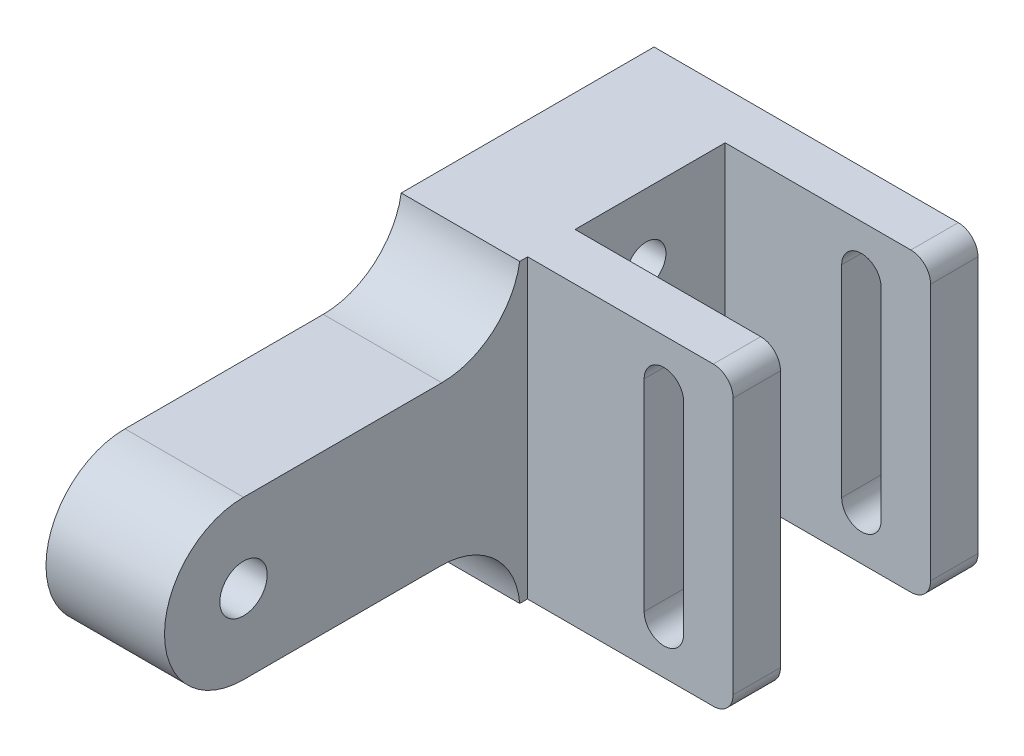
ISO-10303-21;
HEADER;
FILE_DESCRIPTION(('STEP AP214'),'2;1');
FILE_NAME('part.step','',(''),(''),'','','');
FILE_SCHEMA(('AUTOMOTIVE_DESIGN { 1 0 10303 214 1 1 1 1 }'));
ENDSEC;
DATA;
#1=APPLICATION_CONTEXT('core data for automotive mechanical design processes');
#2=APPLICATION_PROTOCOL_DEFINITION('international standard','automotive_design',2000,#1);
#3=PRODUCT_CONTEXT('',#1,'mechanical');
#4=PRODUCT('Part','Part','',(#3));
#5=PRODUCT_RELATED_PRODUCT_CATEGORY('part','',(#4));
#6=PRODUCT_DEFINITION_FORMATION('','',#4);
#7=PRODUCT_DEFINITION_CONTEXT('part definition',#1,'design');
#8=PRODUCT_DEFINITION('design','',#6,#7);
#9=PRODUCT_DEFINITION_SHAPE('','',#8);
#10=(LENGTH_UNIT() NAMED_UNIT(*) SI_UNIT(.MILLI.,.METRE.));
#11=(NAMED_UNIT(*) PLANE_ANGLE_UNIT() SI_UNIT($,.RADIAN.));
#12=(NAMED_UNIT(*) SI_UNIT($,.STERADIAN.) SOLID_ANGLE_UNIT());
#13=UNCERTAINTY_MEASURE_WITH_UNIT(LENGTH_MEASURE(1.E-05),#10,'distance_accuracy_value','');
#14=(GEOMETRIC_REPRESENTATION_CONTEXT(3) GLOBAL_UNCERTAINTY_ASSIGNED_CONTEXT((#13)) GLOBAL_UNIT_ASSIGNED_CONTEXT((#10,
#11,#12)) REPRESENTATION_CONTEXT('',''));
#15=CARTESIAN_POINT('',(0.,0.,0.));
#16=DIRECTION('',(0.,0.,1.));
#17=DIRECTION('',(1.,0.,0.));
#18=AXIS2_PLACEMENT_3D('',#15,#16,#17);
#19=CARTESIAN_POINT('',(30.,-39.244278892318,51.9237920874972));
#20=DIRECTION('',(-1.,0.,0.));
#21=DIRECTION('',(0.,0.,1.));
#22=AXIS2_PLACEMENT_3D('',#19,#20,#21);
#23=PLANE('',#22);
#24=CARTESIAN_POINT('',(30.,-16.6963557226771,0.));
#25=DIRECTION('',(1.,0.,0.));
#26=DIRECTION('',(0.,0.,-1.));
#27=AXIS2_PLACEMENT_3D('',#24,#25,#26);
#28=CIRCLE('',#27,5.);
#29=CARTESIAN_POINT('',(30.,-16.6963557226771,-5.));
#30=VERTEX_POINT('',#29);
#31=EDGE_CURVE('E390',#30,#30,#28,.T.);
#32=ORIENTED_EDGE('',*,*,#31,.F.);
#33=EDGE_LOOP('',(#32));
#34=FACE_BOUND('',#33,.T.);
#35=CARTESIAN_POINT('',(30.,20.755721107682,0.));
#36=DIRECTION('',(1.,0.,0.));
#37=DIRECTION('',(0.,0.,-1.));
#38=AXIS2_PLACEMENT_3D('',#35,#36,#37);
#39=CIRCLE('',#38,5.);
#40=CARTESIAN_POINT('',(30.,20.755721107682,-5.));
#41=VERTEX_POINT('',#40);
#42=EDGE_CURVE('E396',#41,#41,#39,.T.);
#43=ORIENTED_EDGE('',*,*,#42,.F.);
#44=EDGE_LOOP('',(#43));
#45=FACE_BOUND('',#44,.T.);
#46=DIRECTION('',(0.,1.,0.));
#47=VECTOR('',#46,1.);
#48=CARTESIAN_POINT('',(30.,37.5,18.));
#49=LINE('',#48,#47);
#50=CARTESIAN_POINT('',(30.,-37.5,18.));
#51=VERTEX_POINT('',#50);
#52=CARTESIAN_POINT('',(30.,37.5,18.));
#53=VERTEX_POINT('',#52);
#54=EDGE_CURVE('E265',#51,#53,#49,.T.);
#55=ORIENTED_EDGE('',*,*,#54,.F.);
#56=DIRECTION('',(0.,0.,-1.));
#57=VECTOR('',#56,1.);
#58=CARTESIAN_POINT('',(30.,-37.5,32.));
#59=LINE('',#58,#57);
#60=CARTESIAN_POINT('',(30.,-37.5,-20.));
#61=VERTEX_POINT('',#60);
#62=EDGE_CURVE('E425',#51,#61,#59,.T.);
#63=ORIENTED_EDGE('',*,*,#62,.T.);
#64=DIRECTION('',(0.,1.,0.));
#65=VECTOR('',#64,1.);
#66=CARTESIAN_POINT('',(30.,37.5,-20.));
#67=LINE('',#66,#65);
#68=CARTESIAN_POINT('',(30.,37.5,-20.));
#69=VERTEX_POINT('',#68);
#70=EDGE_CURVE('E11',#61,#69,#67,.T.);
#71=ORIENTED_EDGE('',*,*,#70,.T.);
#72=DIRECTION('',(0.,0.,1.));
#73=VECTOR('',#72,1.);
#74=CARTESIAN_POINT('',(30.,37.5,32.));
#75=LINE('',#74,#73);
#76=EDGE_CURVE('E57',#69,#53,#75,.T.);
#77=ORIENTED_EDGE('',*,*,#76,.T.);
#78=EDGE_LOOP('',(#55,#63,#71,#77));
#79=FACE_BOUND('',#78,.T.);
#80=ADVANCED_FACE('F33',(#34,#45,#79),#23,.F.);
#81=CARTESIAN_POINT('',(30.,-37.5,32.));
#82=VERTEX_POINT('',#81);
#83=CARTESIAN_POINT('',(30.,-37.5,30.));
#84=VERTEX_POINT('',#83);
#85=EDGE_CURVE('E421',#82,#84,#59,.T.);
#86=ORIENTED_EDGE('',*,*,#85,.T.);
#87=DIRECTION('',(0.,1.,0.));
#88=VECTOR('',#87,1.);
#89=CARTESIAN_POINT('',(30.,37.5,30.));
#90=LINE('',#89,#88);
#91=CARTESIAN_POINT('',(30.,37.5,30.));
#92=VERTEX_POINT('',#91);
#93=EDGE_CURVE('E50',#84,#92,#90,.T.);
#94=ORIENTED_EDGE('',*,*,#93,.T.);
#95=CARTESIAN_POINT('',(30.,37.5,32.));
#96=VERTEX_POINT('',#95);
#97=EDGE_CURVE('E410',#92,#96,#75,.T.);
#98=ORIENTED_EDGE('',*,*,#97,.T.);
#99=CARTESIAN_POINT('',(30.,40.755721107682,51.7332278167814));
#100=DIRECTION('',(-1.,0.,0.));
#101=DIRECTION('',(0.,0.,-1.));
#102=AXIS2_PLACEMENT_3D('',#99,#100,#101);
#103=CIRCLE('',#102,20.);
#104=CARTESIAN_POINT('',(30.,20.755721107682,51.7332278167814));
#105=VERTEX_POINT('',#104);
#106=EDGE_CURVE('E409',#96,#105,#103,.T.);
#107=ORIENTED_EDGE('',*,*,#106,.T.);
#108=DIRECTION('',(0.,0.,1.));
#109=VECTOR('',#108,1.);
#110=CARTESIAN_POINT('',(30.,20.755721107682,101.923792087497));
#111=LINE('',#110,#109);
#112=CARTESIAN_POINT('',(30.,20.755721107682,101.923792087497));
#113=VERTEX_POINT('',#112);
#114=EDGE_CURVE('E412',#105,#113,#111,.T.);
#115=ORIENTED_EDGE('',*,*,#114,.T.);
#116=CARTESIAN_POINT('',(30.,0.755721107682024,101.923792087497));
#117=DIRECTION('',(1.,0.,0.));
#118=DIRECTION('',(0.,0.,-1.));
#119=AXIS2_PLACEMENT_3D('',#116,#117,#118);
#120=CIRCLE('',#119,20.);
#121=CARTESIAN_POINT('',(30.,-19.244278892318,101.923792087497));
#122=VERTEX_POINT('',#121);
#123=EDGE_CURVE('E414',#113,#122,#120,.T.);
#124=ORIENTED_EDGE('',*,*,#123,.T.);
#125=DIRECTION('',(0.,0.,-1.));
#126=VECTOR('',#125,1.);
#127=CARTESIAN_POINT('',(30.,-19.244278892318,101.923792087497));
#128=LINE('',#127,#126);
#129=CARTESIAN_POINT('',(30.,-19.244278892318,51.9237920874972));
#130=VERTEX_POINT('',#129);
#131=EDGE_CURVE('E416',#122,#130,#128,.T.);
#132=ORIENTED_EDGE('',*,*,#131,.T.);
#133=CARTESIAN_POINT('',(30.,-39.244278892318,51.9237920874972));
#134=DIRECTION('',(-1.,0.,0.));
#135=DIRECTION('',(0.,0.,1.));
#136=AXIS2_PLACEMENT_3D('',#133,#134,#135);
#137=CIRCLE('',#136,20.);
#138=EDGE_CURVE('E418',#130,#82,#137,.T.);
#139=ORIENTED_EDGE('',*,*,#138,.T.);
#140=EDGE_LOOP('',(#86,#94,#98,#107,#115,#124,#132,#139));
#141=FACE_BOUND('',#140,.T.);
#142=CARTESIAN_POINT('',(30.,0.755721107682024,101.923792087497));
#143=DIRECTION('',(1.,0.,0.));
#144=DIRECTION('',(0.,0.,-1.));
#145=AXIS2_PLACEMENT_3D('',#142,#143,#144);
#146=CIRCLE('',#145,6.);
#147=CARTESIAN_POINT('',(30.,0.755721107682024,95.9237920874971));
#148=VERTEX_POINT('',#147);
#149=EDGE_CURVE('E402',#148,#148,#146,.T.);
#150=ORIENTED_EDGE('',*,*,#149,.F.);
#151=EDGE_LOOP('',(#150));
#152=FACE_BOUND('',#151,.T.);
#153=ADVANCED_FACE('F486',(#141,#152),#23,.F.);
#154=CARTESIAN_POINT('',(0.,-39.244278892318,51.9237920874972));
#155=DIRECTION('',(-1.,0.,0.));
#156=DIRECTION('',(0.,0.,1.));
#157=AXIS2_PLACEMENT_3D('',#154,#155,#156);
#158=PLANE('',#157);
#159=CARTESIAN_POINT('',(0.,20.755721107682,0.));
#160=DIRECTION('',(1.,0.,0.));
#161=DIRECTION('',(0.,0.,-1.));
#162=AXIS2_PLACEMENT_3D('',#159,#160,#161);
#163=CIRCLE('',#162,5.);
#164=CARTESIAN_POINT('',(0.,20.755721107682,-5.));
#165=VERTEX_POINT('',#164);
#166=EDGE_CURVE('E393',#165,#165,#163,.T.);
#167=ORIENTED_EDGE('',*,*,#166,.T.);
#168=EDGE_LOOP('',(#167));
#169=FACE_BOUND('',#168,.T.);
#170=DIRECTION('',(0.,1.,0.));
#171=VECTOR('',#170,1.);
#172=CARTESIAN_POINT('',(0.,37.5,-32.));
#173=LINE('',#172,#171);
#174=CARTESIAN_POINT('',(0.,-37.5,-32.));
#175=VERTEX_POINT('',#174);
#176=CARTESIAN_POINT('',(0.,37.5,-32.));
#177=VERTEX_POINT('',#176);
#178=EDGE_CURVE('E405',#175,#177,#173,.T.);
#179=ORIENTED_EDGE('',*,*,#178,.F.);
#180=DIRECTION('',(0.,0.,-1.));
#181=VECTOR('',#180,1.);
#182=CARTESIAN_POINT('',(0.,-37.5,32.));
#183=LINE('',#182,#181);
#184=CARTESIAN_POINT('',(0.,-37.5,32.));
#185=VERTEX_POINT('',#184);
#186=EDGE_CURVE('E440',#185,#175,#183,.T.);
#187=ORIENTED_EDGE('',*,*,#186,.F.);
#188=CARTESIAN_POINT('',(0.,-39.244278892318,51.9237920874972));
#189=DIRECTION('',(-1.,0.,0.));
#190=DIRECTION('',(0.,0.,1.));
#191=AXIS2_PLACEMENT_3D('',#188,#189,#190);
#192=CIRCLE('',#191,20.);
#193=CARTESIAN_POINT('',(0.,-19.244278892318,51.9237920874972));
#194=VERTEX_POINT('',#193);
#195=EDGE_CURVE('E438',#194,#185,#192,.T.);
#196=ORIENTED_EDGE('',*,*,#195,.F.);
#197=DIRECTION('',(0.,0.,-1.));
#198=VECTOR('',#197,1.);
#199=CARTESIAN_POINT('',(0.,-19.244278892318,101.923792087497));
#200=LINE('',#199,#198);
#201=CARTESIAN_POINT('',(0.,-19.244278892318,101.923792087497));
#202=VERTEX_POINT('',#201);
#203=EDGE_CURVE('E436',#202,#194,#200,.T.);
#204=ORIENTED_EDGE('',*,*,#203,.F.);
#205=CARTESIAN_POINT('',(0.,0.755721107682024,101.923792087497));
#206=DIRECTION('',(1.,0.,0.));
#207=DIRECTION('',(0.,0.,-1.));
#208=AXIS2_PLACEMENT_3D('',#205,#206,#207);
#209=CIRCLE('',#208,20.);
#210=CARTESIAN_POINT('',(0.,20.755721107682,101.923792087497));
#211=VERTEX_POINT('',#210);
#212=EDGE_CURVE('E434',#211,#202,#209,.T.);
#213=ORIENTED_EDGE('',*,*,#212,.F.);
#214=DIRECTION('',(0.,0.,1.));
#215=VECTOR('',#214,1.);
#216=CARTESIAN_POINT('',(0.,20.755721107682,101.923792087497));
#217=LINE('',#216,#215);
#218=CARTESIAN_POINT('',(0.,20.755721107682,51.7332278167814));
#219=VERTEX_POINT('',#218);
#220=EDGE_CURVE('E432',#219,#211,#217,.T.);
#221=ORIENTED_EDGE('',*,*,#220,.F.);
#222=CARTESIAN_POINT('',(0.,40.755721107682,51.7332278167814));
#223=DIRECTION('',(-1.,0.,0.));
#224=DIRECTION('',(0.,0.,-1.));
#225=AXIS2_PLACEMENT_3D('',#222,#223,#224);
#226=CIRCLE('',#225,20.);
#227=CARTESIAN_POINT('',(0.,37.5,32.));
#228=VERTEX_POINT('',#227);
#229=EDGE_CURVE('E430',#228,#219,#226,.T.);
#230=ORIENTED_EDGE('',*,*,#229,.F.);
#231=DIRECTION('',(0.,0.,1.));
#232=VECTOR('',#231,1.);
#233=CARTESIAN_POINT('',(0.,37.5,32.));
#234=LINE('',#233,#232);
#235=EDGE_CURVE('E428',#177,#228,#234,.T.);
#236=ORIENTED_EDGE('',*,*,#235,.F.);
#237=EDGE_LOOP('',(#179,#187,#196,#204,#213,#221,#230,#236));
#238=FACE_BOUND('',#237,.T.);
#239=CARTESIAN_POINT('',(0.,0.755721107682024,101.923792087497));
#240=DIRECTION('',(1.,0.,0.));
#241=DIRECTION('',(0.,0.,-1.));
#242=AXIS2_PLACEMENT_3D('',#239,#240,#241);
#243=CIRCLE('',#242,6.);
#244=CARTESIAN_POINT('',(0.,0.755721107682024,95.9237920874971));
#245=VERTEX_POINT('',#244);
#246=EDGE_CURVE('E399',#245,#245,#243,.T.);
#247=ORIENTED_EDGE('',*,*,#246,.T.);
#248=EDGE_LOOP('',(#247));
#249=FACE_BOUND('',#248,.T.);
#250=CARTESIAN_POINT('',(0.,-16.6963557226771,0.));
#251=DIRECTION('',(1.,0.,0.));
#252=DIRECTION('',(0.,0.,-1.));
#253=AXIS2_PLACEMENT_3D('',#250,#251,#252);
#254=CIRCLE('',#253,5.);
#255=CARTESIAN_POINT('',(0.,-16.6963557226771,-5.));
#256=VERTEX_POINT('',#255);
#257=EDGE_CURVE('E381',#256,#256,#254,.T.);
#258=ORIENTED_EDGE('',*,*,#257,.T.);
#259=EDGE_LOOP('',(#258));
#260=FACE_BOUND('',#259,.T.);
#261=ADVANCED_FACE('F474',(#169,#238,#249,#260),#158,.T.);
#262=CARTESIAN_POINT('',(30.,37.5,-32.));
#263=DIRECTION('',(0.,0.,1.));
#264=DIRECTION('',(0.,-1.,0.));
#265=AXIS2_PLACEMENT_3D('',#262,#263,#264);
#266=PLANE('',#265);
#267=ORIENTED_EDGE('',*,*,#178,.T.);
#268=DIRECTION('',(-1.,0.,0.));
#269=VECTOR('',#268,1.);
#270=CARTESIAN_POINT('',(30.,37.5,-32.));
#271=LINE('',#270,#269);
#272=CARTESIAN_POINT('',(77.,37.5,-32.));
#273=VERTEX_POINT('',#272);
#274=EDGE_CURVE('E37',#273,#177,#271,.T.);
#275=ORIENTED_EDGE('',*,*,#274,.F.);
#276=CARTESIAN_POINT('',(77.,32.5,-32.));
#277=DIRECTION('',(0.,0.,-1.));
#278=DIRECTION('',(0.,1.,0.));
#279=AXIS2_PLACEMENT_3D('',#276,#277,#278);
#280=CIRCLE('',#279,5.);
#281=CARTESIAN_POINT('',(82.,32.5,-32.));
#282=VERTEX_POINT('',#281);
#283=EDGE_CURVE('E368',#273,#282,#280,.T.);
#284=ORIENTED_EDGE('',*,*,#283,.T.);
#285=DIRECTION('',(0.,-1.,0.));
#286=VECTOR('',#285,1.);
#287=CARTESIAN_POINT('',(82.,32.5,-32.));
#288=LINE('',#287,#286);
#289=CARTESIAN_POINT('',(82.,-32.5433108041781,-32.));
#290=VERTEX_POINT('',#289);
#291=EDGE_CURVE('E371',#282,#290,#288,.T.);
#292=ORIENTED_EDGE('',*,*,#291,.T.);
#293=CARTESIAN_POINT('',(77.,-32.5433108041781,-32.));
#294=DIRECTION('',(0.,0.,-1.));
#295=DIRECTION('',(0.,-1.,0.));
#296=AXIS2_PLACEMENT_3D('',#293,#294,#295);
#297=CIRCLE('',#296,5.);
#298=CARTESIAN_POINT('',(77.,-37.5433108041781,-32.));
#299=VERTEX_POINT('',#298);
#300=EDGE_CURVE('E374',#290,#299,#297,.T.);
#301=ORIENTED_EDGE('',*,*,#300,.T.);
#302=DIRECTION('',(-1.,0.,0.));
#303=VECTOR('',#302,1.);
#304=CARTESIAN_POINT('',(30.,-37.5433108041781,-32.));
#305=LINE('',#304,#303);
#306=CARTESIAN_POINT('',(30.,-37.5433108041781,-32.));
#307=VERTEX_POINT('',#306);
#308=EDGE_CURVE('E350',#299,#307,#305,.T.);
#309=ORIENTED_EDGE('',*,*,#308,.T.);
#310=DIRECTION('',(0.,1.,0.));
#311=VECTOR('',#310,1.);
#312=CARTESIAN_POINT('',(30.,37.5,-32.));
#313=LINE('',#312,#311);
#314=CARTESIAN_POINT('',(30.,-37.5,-32.));
#315=VERTEX_POINT('',#314);
#316=EDGE_CURVE('E341',#307,#315,#313,.T.);
#317=ORIENTED_EDGE('',*,*,#316,.T.);
#318=DIRECTION('',(-1.,0.,0.));
#319=VECTOR('',#318,1.);
#320=CARTESIAN_POINT('',(30.,-37.5,-32.));
#321=LINE('',#320,#319);
#322=EDGE_CURVE('E423',#315,#175,#321,.T.);
#323=ORIENTED_EDGE('',*,*,#322,.T.);
#324=EDGE_LOOP('',(#267,#275,#284,#292,#301,#309,#317,#323));
#325=FACE_BOUND('',#324,.T.);
#326=DIRECTION('',(0.,-1.,0.));
#327=VECTOR('',#326,1.);
#328=CARTESIAN_POINT('',(69.4907730491482,25.5,-32.));
#329=LINE('',#328,#327);
#330=CARTESIAN_POINT('',(69.4907730491482,25.5,-32.));
#331=VERTEX_POINT('',#330);
#332=CARTESIAN_POINT('',(69.4907730491482,-25.5433108041781,-32.));
#333=VERTEX_POINT('',#332);
#334=EDGE_CURVE('E331',#331,#333,#329,.T.);
#335=ORIENTED_EDGE('',*,*,#334,.F.);
#336=CARTESIAN_POINT('',(64.4907730491482,25.5,-32.));
#337=DIRECTION('',(0.,0.,-1.));
#338=DIRECTION('',(0.,1.,0.));
#339=AXIS2_PLACEMENT_3D('',#336,#337,#338);
#340=CIRCLE('',#339,5.00000000000002);
#341=CARTESIAN_POINT('',(59.4907730491481,25.5,-32.));
#342=VERTEX_POINT('',#341);
#343=EDGE_CURVE('E308',#342,#331,#340,.T.);
#344=ORIENTED_EDGE('',*,*,#343,.F.);
#345=DIRECTION('',(0.,1.,0.));
#346=VECTOR('',#345,1.);
#347=CARTESIAN_POINT('',(59.4907730491481,25.5,-32.));
#348=LINE('',#347,#346);
#349=CARTESIAN_POINT('',(59.4907730491481,-25.5433108041781,-32.));
#350=VERTEX_POINT('',#349);
#351=EDGE_CURVE('E320',#350,#342,#348,.T.);
#352=ORIENTED_EDGE('',*,*,#351,.F.);
#353=CARTESIAN_POINT('',(64.4907730491481,-25.5433108041781,-32.));
#354=DIRECTION('',(0.,0.,-1.));
#355=DIRECTION('',(0.,1.,0.));
#356=AXIS2_PLACEMENT_3D('',#353,#354,#355);
#357=CIRCLE('',#356,5.00000000000002);
#358=EDGE_CURVE('E334',#333,#350,#357,.T.);
#359=ORIENTED_EDGE('',*,*,#358,.F.);
#360=EDGE_LOOP('',(#335,#344,#352,#359));
#361=FACE_BOUND('',#360,.T.);
#362=ADVANCED_FACE('F35',(#325,#361),#266,.F.);
#363=CARTESIAN_POINT('',(30.,37.5,32.));
#364=DIRECTION('',(0.,-1.,0.));
#365=DIRECTION('',(0.,0.,-1.));
#366=AXIS2_PLACEMENT_3D('',#363,#364,#365);
#367=PLANE('',#366);
#368=ORIENTED_EDGE('',*,*,#235,.T.);
#369=DIRECTION('',(-1.,0.,0.));
#370=VECTOR('',#369,1.);
#371=CARTESIAN_POINT('',(30.,37.5,32.));
#372=LINE('',#371,#370);
#373=EDGE_CURVE('E458',#96,#228,#372,.T.);
#374=ORIENTED_EDGE('',*,*,#373,.F.);
#375=ORIENTED_EDGE('',*,*,#97,.F.);
#376=DIRECTION('',(1.,0.,0.));
#377=VECTOR('',#376,1.);
#378=CARTESIAN_POINT('',(30.,37.5,30.));
#379=LINE('',#378,#377);
#380=CARTESIAN_POINT('',(77.,37.5,30.));
#381=VERTEX_POINT('',#380);
#382=EDGE_CURVE('E272',#92,#381,#379,.T.);
#383=ORIENTED_EDGE('',*,*,#382,.T.);
#384=DIRECTION('',(0.,0.,-1.));
#385=VECTOR('',#384,1.);
#386=CARTESIAN_POINT('',(77.,37.5,30.));
#387=LINE('',#386,#385);
#388=CARTESIAN_POINT('',(77.,37.5,18.));
#389=VERTEX_POINT('',#388);
#390=EDGE_CURVE('E287',#381,#389,#387,.T.);
#391=ORIENTED_EDGE('',*,*,#390,.T.);
#392=DIRECTION('',(1.,0.,0.));
#393=VECTOR('',#392,1.);
#394=CARTESIAN_POINT('',(30.,37.5,18.));
#395=LINE('',#394,#393);
#396=EDGE_CURVE('E291',#53,#389,#395,.T.);
#397=ORIENTED_EDGE('',*,*,#396,.F.);
#398=ORIENTED_EDGE('',*,*,#76,.F.);
#399=DIRECTION('',(1.,0.,0.));
#400=VECTOR('',#399,1.);
#401=CARTESIAN_POINT('',(30.,37.5,-20.));
#402=LINE('',#401,#400);
#403=CARTESIAN_POINT('',(77.,37.5,-20.));
#404=VERTEX_POINT('',#403);
#405=EDGE_CURVE('E349',#69,#404,#402,.T.);
#406=ORIENTED_EDGE('',*,*,#405,.T.);
#407=DIRECTION('',(0.,0.,-1.));
#408=VECTOR('',#407,1.);
#409=CARTESIAN_POINT('',(77.,37.5,-20.));
#410=LINE('',#409,#408);
#411=EDGE_CURVE('E365',#404,#273,#410,.T.);
#412=ORIENTED_EDGE('',*,*,#411,.T.);
#413=ORIENTED_EDGE('',*,*,#274,.T.);
#414=EDGE_LOOP('',(#368,#374,#375,#383,#391,#397,#398,#406,#412,#413));
#415=FACE_BOUND('',#414,.T.);
#416=ADVANCED_FACE('F466',(#415),#367,.F.);
#417=CARTESIAN_POINT('',(30.,40.755721107682,51.7332278167814));
#418=DIRECTION('',(-1.,0.,0.));
#419=DIRECTION('',(0.,0.,1.));
#420=AXIS2_PLACEMENT_3D('',#417,#418,#419);
#421=CYLINDRICAL_SURFACE('',#420,20.);
#422=ORIENTED_EDGE('',*,*,#229,.T.);
#423=DIRECTION('',(-1.,0.,0.));
#424=VECTOR('',#423,1.);
#425=CARTESIAN_POINT('',(30.,20.755721107682,51.7332278167814));
#426=LINE('',#425,#424);
#427=EDGE_CURVE('E456',#105,#219,#426,.T.);
#428=ORIENTED_EDGE('',*,*,#427,.F.);
#429=ORIENTED_EDGE('',*,*,#106,.F.);
#430=ORIENTED_EDGE('',*,*,#373,.T.);
#431=EDGE_LOOP('',(#422,#428,#429,#430));
#432=FACE_BOUND('',#431,.T.);
#433=ADVANCED_FACE('F480',(#432),#421,.F.);
#434=CARTESIAN_POINT('',(30.,20.755721107682,101.923792087497));
#435=DIRECTION('',(0.,-1.,0.));
#436=DIRECTION('',(0.,0.,-1.));
#437=AXIS2_PLACEMENT_3D('',#434,#435,#436);
#438=PLANE('',#437);
#439=ORIENTED_EDGE('',*,*,#220,.T.);
#440=DIRECTION('',(-1.,0.,0.));
#441=VECTOR('',#440,1.);
#442=CARTESIAN_POINT('',(30.,20.755721107682,101.923792087497));
#443=LINE('',#442,#441);
#444=EDGE_CURVE('E453',#113,#211,#443,.T.);
#445=ORIENTED_EDGE('',*,*,#444,.F.);
#446=ORIENTED_EDGE('',*,*,#114,.F.);
#447=ORIENTED_EDGE('',*,*,#427,.T.);
#448=EDGE_LOOP('',(#439,#445,#446,#447));
#449=FACE_BOUND('',#448,.T.);
#450=ADVANCED_FACE('F483',(#449),#438,.F.);
#451=CARTESIAN_POINT('',(30.,0.755721107682024,101.923792087497));
#452=DIRECTION('',(-1.,0.,0.));
#453=DIRECTION('',(0.,0.,1.));
#454=AXIS2_PLACEMENT_3D('',#451,#452,#453);
#455=CYLINDRICAL_SURFACE('',#454,20.);
#456=ORIENTED_EDGE('',*,*,#212,.T.);
#457=DIRECTION('',(-1.,0.,0.));
#458=VECTOR('',#457,1.);
#459=CARTESIAN_POINT('',(30.,-19.244278892318,101.923792087497));
#460=LINE('',#459,#458);
#461=EDGE_CURVE('E450',#122,#202,#460,.T.);
#462=ORIENTED_EDGE('',*,*,#461,.F.);
#463=ORIENTED_EDGE('',*,*,#123,.F.);
#464=ORIENTED_EDGE('',*,*,#444,.T.);
#465=EDGE_LOOP('',(#456,#462,#463,#464));
#466=FACE_BOUND('',#465,.T.);
#467=ADVANCED_FACE('F525',(#466),#455,.T.);
#468=CARTESIAN_POINT('',(30.,-19.244278892318,101.923792087497));
#469=DIRECTION('',(0.,1.,0.));
#470=DIRECTION('',(0.,0.,1.));
#471=AXIS2_PLACEMENT_3D('',#468,#469,#470);
#472=PLANE('',#471);
#473=ORIENTED_EDGE('',*,*,#203,.T.);
#474=DIRECTION('',(-1.,0.,0.));
#475=VECTOR('',#474,1.);
#476=CARTESIAN_POINT('',(30.,-19.244278892318,51.9237920874972));
#477=LINE('',#476,#475);
#478=EDGE_CURVE('E447',#130,#194,#477,.T.);
#479=ORIENTED_EDGE('',*,*,#478,.F.);
#480=ORIENTED_EDGE('',*,*,#131,.F.);
#481=ORIENTED_EDGE('',*,*,#461,.T.);
#482=EDGE_LOOP('',(#473,#479,#480,#481));
#483=FACE_BOUND('',#482,.T.);
#484=ADVANCED_FACE('F522',(#483),#472,.F.);
#485=CARTESIAN_POINT('',(30.,-39.244278892318,51.9237920874972));
#486=DIRECTION('',(-1.,0.,0.));
#487=DIRECTION('',(0.,0.,1.));
#488=AXIS2_PLACEMENT_3D('',#485,#486,#487);
#489=CYLINDRICAL_SURFACE('',#488,20.);
#490=ORIENTED_EDGE('',*,*,#195,.T.);
#491=DIRECTION('',(-1.,0.,0.));
#492=VECTOR('',#491,1.);
#493=CARTESIAN_POINT('',(30.,-37.5,32.));
#494=LINE('',#493,#492);
#495=EDGE_CURVE('E444',#82,#185,#494,.T.);
#496=ORIENTED_EDGE('',*,*,#495,.F.);
#497=ORIENTED_EDGE('',*,*,#138,.F.);
#498=ORIENTED_EDGE('',*,*,#478,.T.);
#499=EDGE_LOOP('',(#490,#496,#497,#498));
#500=FACE_BOUND('',#499,.T.);
#501=ADVANCED_FACE('F518',(#500),#489,.F.);
#502=CARTESIAN_POINT('',(30.,-37.5,32.));
#503=DIRECTION('',(0.,1.,0.));
#504=DIRECTION('',(0.,0.,1.));
#505=AXIS2_PLACEMENT_3D('',#502,#503,#504);
#506=PLANE('',#505);
#507=ORIENTED_EDGE('',*,*,#186,.T.);
#508=ORIENTED_EDGE('',*,*,#322,.F.);
#509=EDGE_CURVE('E420',#61,#315,#59,.T.);
#510=ORIENTED_EDGE('',*,*,#509,.F.);
#511=ORIENTED_EDGE('',*,*,#62,.F.);
#512=EDGE_CURVE('E424',#84,#51,#59,.T.);
#513=ORIENTED_EDGE('',*,*,#512,.F.);
#514=ORIENTED_EDGE('',*,*,#85,.F.);
#515=ORIENTED_EDGE('',*,*,#495,.T.);
#516=EDGE_LOOP('',(#507,#508,#510,#511,#513,#514,#515));
#517=FACE_BOUND('',#516,.T.);
#518=ADVANCED_FACE('F514',(#517),#506,.F.);
#519=CARTESIAN_POINT('',(30.,0.755721107682024,101.923792087497));
#520=DIRECTION('',(-1.,0.,0.));
#521=DIRECTION('',(0.,0.,1.));
#522=AXIS2_PLACEMENT_3D('',#519,#520,#521);
#523=CYLINDRICAL_SURFACE('',#522,6.);
#524=ORIENTED_EDGE('',*,*,#149,.T.);
#525=EDGE_LOOP('',(#524));
#526=FACE_BOUND('',#525,.T.);
#527=ORIENTED_EDGE('',*,*,#246,.F.);
#528=EDGE_LOOP('',(#527));
#529=FACE_BOUND('',#528,.T.);
#530=ADVANCED_FACE('F544',(#526,#529),#523,.F.);
#531=CARTESIAN_POINT('',(30.,20.755721107682,0.));
#532=DIRECTION('',(-1.,0.,0.));
#533=DIRECTION('',(0.,0.,1.));
#534=AXIS2_PLACEMENT_3D('',#531,#532,#533);
#535=CYLINDRICAL_SURFACE('',#534,5.);
#536=ORIENTED_EDGE('',*,*,#42,.T.);
#537=EDGE_LOOP('',(#536));
#538=FACE_BOUND('',#537,.T.);
#539=ORIENTED_EDGE('',*,*,#166,.F.);
#540=EDGE_LOOP('',(#539));
#541=FACE_BOUND('',#540,.T.);
#542=ADVANCED_FACE('F568',(#538,#541),#535,.F.);
#543=CARTESIAN_POINT('',(30.,-16.6963557226771,0.));
#544=DIRECTION('',(-1.,0.,0.));
#545=DIRECTION('',(0.,0.,1.));
#546=AXIS2_PLACEMENT_3D('',#543,#544,#545);
#547=CYLINDRICAL_SURFACE('',#546,5.);
#548=ORIENTED_EDGE('',*,*,#31,.T.);
#549=EDGE_LOOP('',(#548));
#550=FACE_BOUND('',#549,.T.);
#551=ORIENTED_EDGE('',*,*,#257,.F.);
#552=EDGE_LOOP('',(#551));
#553=FACE_BOUND('',#552,.T.);
#554=ADVANCED_FACE('F575',(#550,#553),#547,.F.);
#555=CARTESIAN_POINT('',(30.,37.5,-20.));
#556=DIRECTION('',(-1.,0.,0.));
#557=DIRECTION('',(0.,-1.,0.));
#558=AXIS2_PLACEMENT_3D('',#555,#556,#557);
#559=PLANE('',#558);
#560=CARTESIAN_POINT('',(30.,-37.5433108041781,-20.));
#561=VERTEX_POINT('',#560);
#562=EDGE_CURVE('E43',#561,#61,#67,.T.);
#563=ORIENTED_EDGE('',*,*,#562,.T.);
#564=ORIENTED_EDGE('',*,*,#509,.T.);
#565=ORIENTED_EDGE('',*,*,#316,.F.);
#566=DIRECTION('',(0.,0.,-1.));
#567=VECTOR('',#566,1.);
#568=CARTESIAN_POINT('',(30.,-37.5433108041781,-20.));
#569=LINE('',#568,#567);
#570=EDGE_CURVE('E379',#561,#307,#569,.T.);
#571=ORIENTED_EDGE('',*,*,#570,.F.);
#572=EDGE_LOOP('',(#563,#564,#565,#571));
#573=FACE_BOUND('',#572,.T.);
#574=ADVANCED_FACE('F511',(#573),#559,.T.);
#575=CARTESIAN_POINT('',(30.,-37.5433108041781,-20.));
#576=DIRECTION('',(0.,-1.,0.));
#577=DIRECTION('',(1.,0.,0.));
#578=AXIS2_PLACEMENT_3D('',#575,#576,#577);
#579=PLANE('',#578);
#580=ORIENTED_EDGE('',*,*,#308,.F.);
#581=DIRECTION('',(0.,0.,-1.));
#582=VECTOR('',#581,1.);
#583=CARTESIAN_POINT('',(77.,-37.5433108041781,-20.));
#584=LINE('',#583,#582);
#585=CARTESIAN_POINT('',(77.,-37.5433108041781,-20.));
#586=VERTEX_POINT('',#585);
#587=EDGE_CURVE('E382',#586,#299,#584,.T.);
#588=ORIENTED_EDGE('',*,*,#587,.F.);
#589=DIRECTION('',(-1.,0.,0.));
#590=VECTOR('',#589,1.);
#591=CARTESIAN_POINT('',(30.,-37.5433108041781,-20.));
#592=LINE('',#591,#590);
#593=EDGE_CURVE('E362',#586,#561,#592,.T.);
#594=ORIENTED_EDGE('',*,*,#593,.T.);
#595=ORIENTED_EDGE('',*,*,#570,.T.);
#596=EDGE_LOOP('',(#580,#588,#594,#595));
#597=FACE_BOUND('',#596,.T.);
#598=ADVANCED_FACE('F590',(#597),#579,.T.);
#599=CARTESIAN_POINT('',(77.,-32.5433108041781,-20.));
#600=DIRECTION('',(0.,0.,-1.));
#601=DIRECTION('',(0.,1.,0.));
#602=AXIS2_PLACEMENT_3D('',#599,#600,#601);
#603=CYLINDRICAL_SURFACE('',#602,5.);
#604=ORIENTED_EDGE('',*,*,#300,.F.);
#605=DIRECTION('',(0.,0.,-1.));
#606=VECTOR('',#605,1.);
#607=CARTESIAN_POINT('',(82.,-32.5433108041781,-20.));
#608=LINE('',#607,#606);
#609=CARTESIAN_POINT('',(82.,-32.5433108041781,-20.));
#610=VERTEX_POINT('',#609);
#611=EDGE_CURVE('E384',#610,#290,#608,.T.);
#612=ORIENTED_EDGE('',*,*,#611,.F.);
#613=CARTESIAN_POINT('',(77.,-32.5433108041781,-20.));
#614=DIRECTION('',(0.,0.,-1.));
#615=DIRECTION('',(0.,-1.,0.));
#616=AXIS2_PLACEMENT_3D('',#613,#614,#615);
#617=CIRCLE('',#616,5.);
#618=EDGE_CURVE('E359',#610,#586,#617,.T.);
#619=ORIENTED_EDGE('',*,*,#618,.T.);
#620=ORIENTED_EDGE('',*,*,#587,.T.);
#621=EDGE_LOOP('',(#604,#612,#619,#620));
#622=FACE_BOUND('',#621,.T.);
#623=ADVANCED_FACE('F597',(#622),#603,.T.);
#624=CARTESIAN_POINT('',(82.,32.5,-20.));
#625=DIRECTION('',(1.,0.,0.));
#626=DIRECTION('',(0.,1.,0.));
#627=AXIS2_PLACEMENT_3D('',#624,#625,#626);
#628=PLANE('',#627);
#629=ORIENTED_EDGE('',*,*,#291,.F.);
#630=DIRECTION('',(0.,0.,-1.));
#631=VECTOR('',#630,1.);
#632=CARTESIAN_POINT('',(82.,32.5,-20.));
#633=LINE('',#632,#631);
#634=CARTESIAN_POINT('',(82.,32.5,-20.));
#635=VERTEX_POINT('',#634);
#636=EDGE_CURVE('E386',#635,#282,#633,.T.);
#637=ORIENTED_EDGE('',*,*,#636,.F.);
#638=DIRECTION('',(0.,-1.,0.));
#639=VECTOR('',#638,1.);
#640=CARTESIAN_POINT('',(82.,32.5,-20.));
#641=LINE('',#640,#639);
#642=EDGE_CURVE('E356',#635,#610,#641,.T.);
#643=ORIENTED_EDGE('',*,*,#642,.T.);
#644=ORIENTED_EDGE('',*,*,#611,.T.);
#645=EDGE_LOOP('',(#629,#637,#643,#644));
#646=FACE_BOUND('',#645,.T.);
#647=ADVANCED_FACE('F605',(#646),#628,.T.);
#648=CARTESIAN_POINT('',(77.,32.5,-20.));
#649=DIRECTION('',(0.,0.,-1.));
#650=DIRECTION('',(0.,1.,0.));
#651=AXIS2_PLACEMENT_3D('',#648,#649,#650);
#652=CYLINDRICAL_SURFACE('',#651,5.);
#653=ORIENTED_EDGE('',*,*,#283,.F.);
#654=ORIENTED_EDGE('',*,*,#411,.F.);
#655=CARTESIAN_POINT('',(77.,32.5,-20.));
#656=DIRECTION('',(0.,0.,-1.));
#657=DIRECTION('',(0.,1.,0.));
#658=AXIS2_PLACEMENT_3D('',#655,#656,#657);
#659=CIRCLE('',#658,5.);
#660=EDGE_CURVE('E353',#404,#635,#659,.T.);
#661=ORIENTED_EDGE('',*,*,#660,.T.);
#662=ORIENTED_EDGE('',*,*,#636,.T.);
#663=EDGE_LOOP('',(#653,#654,#661,#662));
#664=FACE_BOUND('',#663,.T.);
#665=ADVANCED_FACE('F613',(#664),#652,.T.);
#666=CARTESIAN_POINT('',(77.,-32.5433108041781,-20.));
#667=DIRECTION('',(0.,0.,1.));
#668=DIRECTION('',(0.,-1.,0.));
#669=AXIS2_PLACEMENT_3D('',#666,#667,#668);
#670=PLANE('',#669);
#671=CARTESIAN_POINT('',(64.4907730491482,25.5,-20.));
#672=DIRECTION('',(0.,0.,-1.));
#673=DIRECTION('',(0.,1.,0.));
#674=AXIS2_PLACEMENT_3D('',#671,#672,#673);
#675=CIRCLE('',#674,5.00000000000002);
#676=CARTESIAN_POINT('',(59.4907730491481,25.5,-20.));
#677=VERTEX_POINT('',#676);
#678=CARTESIAN_POINT('',(69.4907730491482,25.5,-20.));
#679=VERTEX_POINT('',#678);
#680=EDGE_CURVE('E316',#677,#679,#675,.T.);
#681=ORIENTED_EDGE('',*,*,#680,.T.);
#682=DIRECTION('',(0.,-1.,0.));
#683=VECTOR('',#682,1.);
#684=CARTESIAN_POINT('',(69.4907730491482,25.5,-20.));
#685=LINE('',#684,#683);
#686=CARTESIAN_POINT('',(69.4907730491482,-25.5433108041781,-20.));
#687=VERTEX_POINT('',#686);
#688=EDGE_CURVE('E319',#679,#687,#685,.T.);
#689=ORIENTED_EDGE('',*,*,#688,.T.);
#690=CARTESIAN_POINT('',(64.4907730491481,-25.5433108041781,-20.));
#691=DIRECTION('',(0.,0.,-1.));
#692=DIRECTION('',(0.,1.,0.));
#693=AXIS2_PLACEMENT_3D('',#690,#691,#692);
#694=CIRCLE('',#693,5.00000000000002);
#695=CARTESIAN_POINT('',(59.4907730491481,-25.5433108041781,-20.));
#696=VERTEX_POINT('',#695);
#697=EDGE_CURVE('E323',#687,#696,#694,.T.);
#698=ORIENTED_EDGE('',*,*,#697,.T.);
#699=DIRECTION('',(0.,1.,0.));
#700=VECTOR('',#699,1.);
#701=CARTESIAN_POINT('',(59.4907730491481,25.5,-20.));
#702=LINE('',#701,#700);
#703=EDGE_CURVE('E326',#696,#677,#702,.T.);
#704=ORIENTED_EDGE('',*,*,#703,.T.);
#705=EDGE_LOOP('',(#681,#689,#698,#704));
#706=FACE_BOUND('',#705,.T.);
#707=ORIENTED_EDGE('',*,*,#562,.F.);
#708=ORIENTED_EDGE('',*,*,#593,.F.);
#709=ORIENTED_EDGE('',*,*,#618,.F.);
#710=ORIENTED_EDGE('',*,*,#642,.F.);
#711=ORIENTED_EDGE('',*,*,#660,.F.);
#712=ORIENTED_EDGE('',*,*,#405,.F.);
#713=ORIENTED_EDGE('',*,*,#70,.F.);
#714=EDGE_LOOP('',(#707,#708,#709,#710,#711,#712,#713));
#715=FACE_BOUND('',#714,.T.);
#716=ADVANCED_FACE('F621',(#706,#715),#670,.T.);
#717=CARTESIAN_POINT('',(64.4907730491482,25.5,-20.));
#718=DIRECTION('',(0.,0.,-1.));
#719=DIRECTION('',(0.,1.,0.));
#720=AXIS2_PLACEMENT_3D('',#717,#718,#719);
#721=CYLINDRICAL_SURFACE('',#720,5.00000000000002);
#722=ORIENTED_EDGE('',*,*,#343,.T.);
#723=DIRECTION('',(0.,0.,-1.));
#724=VECTOR('',#723,1.);
#725=CARTESIAN_POINT('',(69.4907730491482,25.5,-20.));
#726=LINE('',#725,#724);
#727=EDGE_CURVE('E329',#679,#331,#726,.T.);
#728=ORIENTED_EDGE('',*,*,#727,.F.);
#729=ORIENTED_EDGE('',*,*,#680,.F.);
#730=DIRECTION('',(0.,0.,-1.));
#731=VECTOR('',#730,1.);
#732=CARTESIAN_POINT('',(59.4907730491481,25.5,-20.));
#733=LINE('',#732,#731);
#734=EDGE_CURVE('E339',#677,#342,#733,.T.);
#735=ORIENTED_EDGE('',*,*,#734,.T.);
#736=EDGE_LOOP('',(#722,#728,#729,#735));
#737=FACE_BOUND('',#736,.T.);
#738=ADVANCED_FACE('F629',(#737),#721,.F.);
#739=CARTESIAN_POINT('',(59.4907730491481,25.5,-20.));
#740=DIRECTION('',(-1.,0.,0.));
#741=DIRECTION('',(0.,-1.,0.));
#742=AXIS2_PLACEMENT_3D('',#739,#740,#741);
#743=PLANE('',#742);
#744=ORIENTED_EDGE('',*,*,#351,.T.);
#745=ORIENTED_EDGE('',*,*,#734,.F.);
#746=ORIENTED_EDGE('',*,*,#703,.F.);
#747=DIRECTION('',(0.,0.,-1.));
#748=VECTOR('',#747,1.);
#749=CARTESIAN_POINT('',(59.4907730491481,-25.5433108041781,-20.));
#750=LINE('',#749,#748);
#751=EDGE_CURVE('E342',#696,#350,#750,.T.);
#752=ORIENTED_EDGE('',*,*,#751,.T.);
#753=EDGE_LOOP('',(#744,#745,#746,#752));
#754=FACE_BOUND('',#753,.T.);
#755=ADVANCED_FACE('F637',(#754),#743,.F.);
#756=CARTESIAN_POINT('',(64.4907730491481,-25.5433108041781,-20.));
#757=DIRECTION('',(0.,0.,-1.));
#758=DIRECTION('',(0.,1.,0.));
#759=AXIS2_PLACEMENT_3D('',#756,#757,#758);
#760=CYLINDRICAL_SURFACE('',#759,5.00000000000002);
#761=ORIENTED_EDGE('',*,*,#358,.T.);
#762=ORIENTED_EDGE('',*,*,#751,.F.);
#763=ORIENTED_EDGE('',*,*,#697,.F.);
#764=DIRECTION('',(0.,0.,-1.));
#765=VECTOR('',#764,1.);
#766=CARTESIAN_POINT('',(69.4907730491482,-25.5433108041781,-20.));
#767=LINE('',#766,#765);
#768=EDGE_CURVE('E344',#687,#333,#767,.T.);
#769=ORIENTED_EDGE('',*,*,#768,.T.);
#770=EDGE_LOOP('',(#761,#762,#763,#769));
#771=FACE_BOUND('',#770,.T.);
#772=ADVANCED_FACE('F645',(#771),#760,.F.);
#773=CARTESIAN_POINT('',(69.4907730491482,25.5,-20.));
#774=DIRECTION('',(1.,0.,0.));
#775=DIRECTION('',(0.,0.,-1.));
#776=AXIS2_PLACEMENT_3D('',#773,#774,#775);
#777=PLANE('',#776);
#778=ORIENTED_EDGE('',*,*,#334,.T.);
#779=ORIENTED_EDGE('',*,*,#768,.F.);
#780=ORIENTED_EDGE('',*,*,#688,.F.);
#781=ORIENTED_EDGE('',*,*,#727,.T.);
#782=EDGE_LOOP('',(#778,#779,#780,#781));
#783=FACE_BOUND('',#782,.T.);
#784=ADVANCED_FACE('F653',(#783),#777,.F.);
#785=CARTESIAN_POINT('',(30.,37.5,30.));
#786=DIRECTION('',(-1.,0.,0.));
#787=DIRECTION('',(0.,-1.,0.));
#788=AXIS2_PLACEMENT_3D('',#785,#786,#787);
#789=PLANE('',#788);
#790=ORIENTED_EDGE('',*,*,#512,.T.);
#791=CARTESIAN_POINT('',(30.,-37.5433108041781,18.));
#792=VERTEX_POINT('',#791);
#793=EDGE_CURVE('E288',#792,#51,#49,.T.);
#794=ORIENTED_EDGE('',*,*,#793,.F.);
#795=DIRECTION('',(0.,0.,-1.));
#796=VECTOR('',#795,1.);
#797=CARTESIAN_POINT('',(30.,-37.5433108041781,30.));
#798=LINE('',#797,#796);
#799=CARTESIAN_POINT('',(30.,-37.5433108041781,30.));
#800=VERTEX_POINT('',#799);
#801=EDGE_CURVE('E306',#800,#792,#798,.T.);
#802=ORIENTED_EDGE('',*,*,#801,.F.);
#803=EDGE_CURVE('E269',#800,#84,#90,.T.);
#804=ORIENTED_EDGE('',*,*,#803,.T.);
#805=EDGE_LOOP('',(#790,#794,#802,#804));
#806=FACE_BOUND('',#805,.T.);
#807=ADVANCED_FACE('F505',(#806),#789,.T.);
#808=CARTESIAN_POINT('',(30.,-37.5433108041781,30.));
#809=DIRECTION('',(0.,-1.,0.));
#810=DIRECTION('',(1.,0.,0.));
#811=AXIS2_PLACEMENT_3D('',#808,#809,#810);
#812=PLANE('',#811);
#813=DIRECTION('',(-1.,0.,0.));
#814=VECTOR('',#813,1.);
#815=CARTESIAN_POINT('',(30.,-37.5433108041781,18.));
#816=LINE('',#815,#814);
#817=CARTESIAN_POINT('',(77.,-37.5433108041781,18.));
#818=VERTEX_POINT('',#817);
#819=EDGE_CURVE('E303',#818,#792,#816,.T.);
#820=ORIENTED_EDGE('',*,*,#819,.F.);
#821=DIRECTION('',(0.,0.,-1.));
#822=VECTOR('',#821,1.);
#823=CARTESIAN_POINT('',(77.,-37.5433108041781,30.));
#824=LINE('',#823,#822);
#825=CARTESIAN_POINT('',(77.,-37.5433108041781,30.));
#826=VERTEX_POINT('',#825);
#827=EDGE_CURVE('E309',#826,#818,#824,.T.);
#828=ORIENTED_EDGE('',*,*,#827,.F.);
#829=DIRECTION('',(-1.,0.,0.));
#830=VECTOR('',#829,1.);
#831=CARTESIAN_POINT('',(30.,-37.5433108041781,30.));
#832=LINE('',#831,#830);
#833=EDGE_CURVE('E284',#826,#800,#832,.T.);
#834=ORIENTED_EDGE('',*,*,#833,.T.);
#835=ORIENTED_EDGE('',*,*,#801,.T.);
#836=EDGE_LOOP('',(#820,#828,#834,#835));
#837=FACE_BOUND('',#836,.T.);
#838=ADVANCED_FACE('F667',(#837),#812,.T.);
#839=CARTESIAN_POINT('',(77.,-32.5433108041781,30.));
#840=DIRECTION('',(0.,0.,-1.));
#841=DIRECTION('',(0.,1.,0.));
#842=AXIS2_PLACEMENT_3D('',#839,#840,#841);
#843=CYLINDRICAL_SURFACE('',#842,5.);
#844=CARTESIAN_POINT('',(77.,-32.5433108041781,18.));
#845=DIRECTION('',(0.,0.,-1.));
#846=DIRECTION('',(0.,-1.,0.));
#847=AXIS2_PLACEMENT_3D('',#844,#845,#846);
#848=CIRCLE('',#847,5.);
#849=CARTESIAN_POINT('',(82.,-32.5433108041781,18.));
#850=VERTEX_POINT('',#849);
#851=EDGE_CURVE('E300',#850,#818,#848,.T.);
#852=ORIENTED_EDGE('',*,*,#851,.F.);
#853=DIRECTION('',(0.,0.,-1.));
#854=VECTOR('',#853,1.);
#855=CARTESIAN_POINT('',(82.,-32.5433108041781,30.));
#856=LINE('',#855,#854);
#857=CARTESIAN_POINT('',(82.,-32.5433108041781,30.));
#858=VERTEX_POINT('',#857);
#859=EDGE_CURVE('E311',#858,#850,#856,.T.);
#860=ORIENTED_EDGE('',*,*,#859,.F.);
#861=CARTESIAN_POINT('',(77.,-32.5433108041781,30.));
#862=DIRECTION('',(0.,0.,-1.));
#863=DIRECTION('',(0.,-1.,0.));
#864=AXIS2_PLACEMENT_3D('',#861,#862,#863);
#865=CIRCLE('',#864,5.);
#866=EDGE_CURVE('E281',#858,#826,#865,.T.);
#867=ORIENTED_EDGE('',*,*,#866,.T.);
#868=ORIENTED_EDGE('',*,*,#827,.T.);
#869=EDGE_LOOP('',(#852,#860,#867,#868));
#870=FACE_BOUND('',#869,.T.);
#871=ADVANCED_FACE('F674',(#870),#843,.T.);
#872=CARTESIAN_POINT('',(82.,32.5,30.));
#873=DIRECTION('',(1.,0.,0.));
#874=DIRECTION('',(0.,1.,0.));
#875=AXIS2_PLACEMENT_3D('',#872,#873,#874);
#876=PLANE('',#875);
#877=DIRECTION('',(0.,-1.,0.));
#878=VECTOR('',#877,1.);
#879=CARTESIAN_POINT('',(82.,32.5,18.));
#880=LINE('',#879,#878);
#881=CARTESIAN_POINT('',(82.,32.5,18.));
#882=VERTEX_POINT('',#881);
#883=EDGE_CURVE('E297',#882,#850,#880,.T.);
#884=ORIENTED_EDGE('',*,*,#883,.F.);
#885=DIRECTION('',(0.,0.,-1.));
#886=VECTOR('',#885,1.);
#887=CARTESIAN_POINT('',(82.,32.5,30.));
#888=LINE('',#887,#886);
#889=CARTESIAN_POINT('',(82.,32.5,30.));
#890=VERTEX_POINT('',#889);
#891=EDGE_CURVE('E313',#890,#882,#888,.T.);
#892=ORIENTED_EDGE('',*,*,#891,.F.);
#893=DIRECTION('',(0.,-1.,0.));
#894=VECTOR('',#893,1.);
#895=CARTESIAN_POINT('',(82.,32.5,30.));
#896=LINE('',#895,#894);
#897=EDGE_CURVE('E278',#890,#858,#896,.T.);
#898=ORIENTED_EDGE('',*,*,#897,.T.);
#899=ORIENTED_EDGE('',*,*,#859,.T.);
#900=EDGE_LOOP('',(#884,#892,#898,#899));
#901=FACE_BOUND('',#900,.T.);
#902=ADVANCED_FACE('F682',(#901),#876,.T.);
#903=CARTESIAN_POINT('',(77.,32.5,30.));
#904=DIRECTION('',(0.,0.,-1.));
#905=DIRECTION('',(0.,1.,0.));
#906=AXIS2_PLACEMENT_3D('',#903,#904,#905);
#907=CYLINDRICAL_SURFACE('',#906,5.);
#908=CARTESIAN_POINT('',(77.,32.5,18.));
#909=DIRECTION('',(0.,0.,-1.));
#910=DIRECTION('',(0.,1.,0.));
#911=AXIS2_PLACEMENT_3D('',#908,#909,#910);
#912=CIRCLE('',#911,5.);
#913=EDGE_CURVE('E294',#389,#882,#912,.T.);
#914=ORIENTED_EDGE('',*,*,#913,.F.);
#915=ORIENTED_EDGE('',*,*,#390,.F.);
#916=CARTESIAN_POINT('',(77.,32.5,30.));
#917=DIRECTION('',(0.,0.,-1.));
#918=DIRECTION('',(0.,1.,0.));
#919=AXIS2_PLACEMENT_3D('',#916,#917,#918);
#920=CIRCLE('',#919,5.);
#921=EDGE_CURVE('E275',#381,#890,#920,.T.);
#922=ORIENTED_EDGE('',*,*,#921,.T.);
#923=ORIENTED_EDGE('',*,*,#891,.T.);
#924=EDGE_LOOP('',(#914,#915,#922,#923));
#925=FACE_BOUND('',#924,.T.);
#926=ADVANCED_FACE('F496',(#925),#907,.T.);
#927=CARTESIAN_POINT('',(77.,-32.5433108041781,30.));
#928=DIRECTION('',(0.,0.,1.));
#929=DIRECTION('',(0.,-1.,0.));
#930=AXIS2_PLACEMENT_3D('',#927,#928,#929);
#931=PLANE('',#930);
#932=CARTESIAN_POINT('',(64.4907730491482,25.5,30.));
#933=DIRECTION('',(0.,0.,-1.));
#934=DIRECTION('',(0.,1.,0.));
#935=AXIS2_PLACEMENT_3D('',#932,#933,#934);
#936=CIRCLE('',#935,5.00000000000002);
#937=CARTESIAN_POINT('',(59.4907730491482,25.5,30.));
#938=VERTEX_POINT('',#937);
#939=CARTESIAN_POINT('',(69.4907730491482,25.5,30.));
#940=VERTEX_POINT('',#939);
#941=EDGE_CURVE('E229',#938,#940,#936,.T.);
#942=ORIENTED_EDGE('',*,*,#941,.T.);
#943=DIRECTION('',(0.,-1.,0.));
#944=VECTOR('',#943,1.);
#945=CARTESIAN_POINT('',(69.4907730491482,25.5,30.));
#946=LINE('',#945,#944);
#947=CARTESIAN_POINT('',(69.4907730491482,-25.5433108041781,30.));
#948=VERTEX_POINT('',#947);
#949=EDGE_CURVE('E241',#940,#948,#946,.T.);
#950=ORIENTED_EDGE('',*,*,#949,.T.);
#951=CARTESIAN_POINT('',(64.4907730491482,-25.5433108041781,30.));
#952=DIRECTION('',(0.,0.,-1.));
#953=DIRECTION('',(0.,1.,0.));
#954=AXIS2_PLACEMENT_3D('',#951,#952,#953);
#955=CIRCLE('',#954,5.00000000000002);
#956=CARTESIAN_POINT('',(59.4907730491481,-25.5433108041781,30.));
#957=VERTEX_POINT('',#956);
#958=EDGE_CURVE('E245',#948,#957,#955,.T.);
#959=ORIENTED_EDGE('',*,*,#958,.T.);
#960=DIRECTION('',(0.,1.,0.));
#961=VECTOR('',#960,1.);
#962=CARTESIAN_POINT('',(59.4907730491482,25.5,30.));
#963=LINE('',#962,#961);
#964=EDGE_CURVE('E237',#957,#938,#963,.T.);
#965=ORIENTED_EDGE('',*,*,#964,.T.);
#966=EDGE_LOOP('',(#942,#950,#959,#965));
#967=FACE_BOUND('',#966,.T.);
#968=ORIENTED_EDGE('',*,*,#803,.F.);
#969=ORIENTED_EDGE('',*,*,#833,.F.);
#970=ORIENTED_EDGE('',*,*,#866,.F.);
#971=ORIENTED_EDGE('',*,*,#897,.F.);
#972=ORIENTED_EDGE('',*,*,#921,.F.);
#973=ORIENTED_EDGE('',*,*,#382,.F.);
#974=ORIENTED_EDGE('',*,*,#93,.F.);
#975=EDGE_LOOP('',(#968,#969,#970,#971,#972,#973,#974));
#976=FACE_BOUND('',#975,.T.);
#977=ADVANCED_FACE('F247',(#967,#976),#931,.T.);
#978=CARTESIAN_POINT('',(77.,-32.5433108041781,18.));
#979=DIRECTION('',(0.,0.,1.));
#980=DIRECTION('',(0.,-1.,0.));
#981=AXIS2_PLACEMENT_3D('',#978,#979,#980);
#982=PLANE('',#981);
#983=DIRECTION('',(0.,-1.,0.));
#984=VECTOR('',#983,1.);
#985=CARTESIAN_POINT('',(69.4907730491482,25.5,18.));
#986=LINE('',#985,#984);
#987=CARTESIAN_POINT('',(69.4907730491482,25.5,18.));
#988=VERTEX_POINT('',#987);
#989=CARTESIAN_POINT('',(69.4907730491482,-25.5433108041781,18.));
#990=VERTEX_POINT('',#989);
#991=EDGE_CURVE('E259',#988,#990,#986,.T.);
#992=ORIENTED_EDGE('',*,*,#991,.F.);
#993=CARTESIAN_POINT('',(64.4907730491482,25.5,18.));
#994=DIRECTION('',(0.,0.,-1.));
#995=DIRECTION('',(0.,1.,0.));
#996=AXIS2_PLACEMENT_3D('',#993,#994,#995);
#997=CIRCLE('',#996,5.00000000000002);
#998=CARTESIAN_POINT('',(59.4907730491482,25.5,18.));
#999=VERTEX_POINT('',#998);
#1000=EDGE_CURVE('E232',#999,#988,#997,.T.);
#1001=ORIENTED_EDGE('',*,*,#1000,.F.);
#1002=DIRECTION('',(0.,1.,0.));
#1003=VECTOR('',#1002,1.);
#1004=CARTESIAN_POINT('',(59.4907730491482,25.5,18.));
#1005=LINE('',#1004,#1003);
#1006=CARTESIAN_POINT('',(59.4907730491481,-25.5433108041781,18.));
#1007=VERTEX_POINT('',#1006);
#1008=EDGE_CURVE('E250',#1007,#999,#1005,.T.);
#1009=ORIENTED_EDGE('',*,*,#1008,.F.);
#1010=CARTESIAN_POINT('',(64.4907730491482,-25.5433108041781,18.));
#1011=DIRECTION('',(0.,0.,-1.));
#1012=DIRECTION('',(0.,1.,0.));
#1013=AXIS2_PLACEMENT_3D('',#1010,#1011,#1012);
#1014=CIRCLE('',#1013,5.00000000000002);
#1015=EDGE_CURVE('E253',#990,#1007,#1014,.T.);
#1016=ORIENTED_EDGE('',*,*,#1015,.F.);
#1017=EDGE_LOOP('',(#992,#1001,#1009,#1016));
#1018=FACE_BOUND('',#1017,.T.);
#1019=ORIENTED_EDGE('',*,*,#793,.T.);
#1020=ORIENTED_EDGE('',*,*,#54,.T.);
#1021=ORIENTED_EDGE('',*,*,#396,.T.);
#1022=ORIENTED_EDGE('',*,*,#913,.T.);
#1023=ORIENTED_EDGE('',*,*,#883,.T.);
#1024=ORIENTED_EDGE('',*,*,#851,.T.);
#1025=ORIENTED_EDGE('',*,*,#819,.T.);
#1026=EDGE_LOOP('',(#1019,#1020,#1021,#1022,#1023,#1024,#1025));
#1027=FACE_BOUND('',#1026,.T.);
#1028=ADVANCED_FACE('F500',(#1018,#1027),#982,.F.);
#1029=CARTESIAN_POINT('',(64.4907730491482,25.5,30.));
#1030=DIRECTION('',(0.,0.,-1.));
#1031=DIRECTION('',(0.,1.,0.));
#1032=AXIS2_PLACEMENT_3D('',#1029,#1030,#1031);
#1033=CYLINDRICAL_SURFACE('',#1032,5.00000000000002);
#1034=ORIENTED_EDGE('',*,*,#1000,.T.);
#1035=DIRECTION('',(0.,0.,-1.));
#1036=VECTOR('',#1035,1.);
#1037=CARTESIAN_POINT('',(69.4907730491482,25.5,30.));
#1038=LINE('',#1037,#1036);
#1039=EDGE_CURVE('E225',#940,#988,#1038,.T.);
#1040=ORIENTED_EDGE('',*,*,#1039,.F.);
#1041=ORIENTED_EDGE('',*,*,#941,.F.);
#1042=DIRECTION('',(0.,0.,-1.));
#1043=VECTOR('',#1042,1.);
#1044=CARTESIAN_POINT('',(59.4907730491482,25.5,30.));
#1045=LINE('',#1044,#1043);
#1046=EDGE_CURVE('E263',#938,#999,#1045,.T.);
#1047=ORIENTED_EDGE('',*,*,#1046,.T.);
#1048=EDGE_LOOP('',(#1034,#1040,#1041,#1047));
#1049=FACE_BOUND('',#1048,.T.);
#1050=ADVANCED_FACE('F227',(#1049),#1033,.F.);
#1051=CARTESIAN_POINT('',(59.4907730491482,25.5,30.));
#1052=DIRECTION('',(-1.,0.,0.));
#1053=DIRECTION('',(0.,-1.,0.));
#1054=AXIS2_PLACEMENT_3D('',#1051,#1052,#1053);
#1055=PLANE('',#1054);
#1056=ORIENTED_EDGE('',*,*,#1008,.T.);
#1057=ORIENTED_EDGE('',*,*,#1046,.F.);
#1058=ORIENTED_EDGE('',*,*,#964,.F.);
#1059=DIRECTION('',(0.,0.,-1.));
#1060=VECTOR('',#1059,1.);
#1061=CARTESIAN_POINT('',(59.4907730491481,-25.5433108041781,30.));
#1062=LINE('',#1061,#1060);
#1063=EDGE_CURVE('E266',#957,#1007,#1062,.T.);
#1064=ORIENTED_EDGE('',*,*,#1063,.T.);
#1065=EDGE_LOOP('',(#1056,#1057,#1058,#1064));
#1066=FACE_BOUND('',#1065,.T.);
#1067=ADVANCED_FACE('F716',(#1066),#1055,.F.);
#1068=CARTESIAN_POINT('',(64.4907730491482,-25.5433108041781,30.));
#1069=DIRECTION('',(0.,0.,-1.));
#1070=DIRECTION('',(0.,1.,0.));
#1071=AXIS2_PLACEMENT_3D('',#1068,#1069,#1070);
#1072=CYLINDRICAL_SURFACE('',#1071,5.00000000000002);
#1073=ORIENTED_EDGE('',*,*,#1015,.T.);
#1074=ORIENTED_EDGE('',*,*,#1063,.F.);
#1075=ORIENTED_EDGE('',*,*,#958,.F.);
#1076=DIRECTION('',(0.,0.,-1.));
#1077=VECTOR('',#1076,1.);
#1078=CARTESIAN_POINT('',(69.4907730491482,-25.5433108041781,30.));
#1079=LINE('',#1078,#1077);
#1080=EDGE_CURVE('E236',#948,#990,#1079,.T.);
#1081=ORIENTED_EDGE('',*,*,#1080,.T.);
#1082=EDGE_LOOP('',(#1073,#1074,#1075,#1081));
#1083=FACE_BOUND('',#1082,.T.);
#1084=ADVANCED_FACE('F723',(#1083),#1072,.F.);
#1085=CARTESIAN_POINT('',(69.4907730491482,25.5,30.));
#1086=DIRECTION('',(1.,0.,0.));
#1087=DIRECTION('',(0.,0.,-1.));
#1088=AXIS2_PLACEMENT_3D('',#1085,#1086,#1087);
#1089=PLANE('',#1088);
#1090=ORIENTED_EDGE('',*,*,#991,.T.);
#1091=ORIENTED_EDGE('',*,*,#1080,.F.);
#1092=ORIENTED_EDGE('',*,*,#949,.F.);
#1093=ORIENTED_EDGE('',*,*,#1039,.T.);
#1094=EDGE_LOOP('',(#1090,#1091,#1092,#1093));
#1095=FACE_BOUND('',#1094,.T.);
#1096=ADVANCED_FACE('F242',(#1095),#1089,.F.);
#1097=CLOSED_SHELL('',(#80,#153,#261,#362,#416,#433,#450,#467,#484,#501,#518,#530,#542,#554,
#574,#598,#623,#647,#665,#716,#738,#755,#772,#784,#807,#838,#871,#902,#926,#977,#1028,#1050,
#1067,#1084,#1096));
#1098=MANIFOLD_SOLID_BREP('B2',#1097);
#1099=ADVANCED_BREP_SHAPE_REPRESENTATION('',(#18,#1098),#14);
#1100=SHAPE_DEFINITION_REPRESENTATION(#9,#1099);
ENDSEC;
END-ISO-10303-21;
